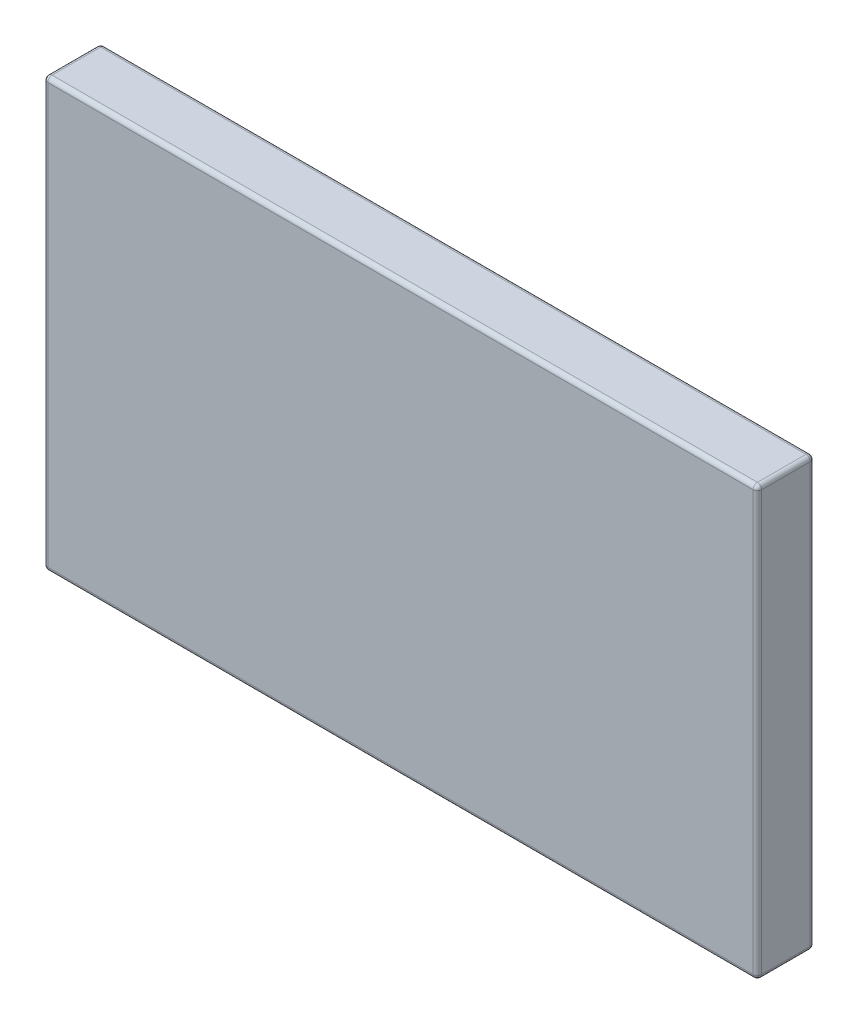
ISO-10303-21;
HEADER;
FILE_DESCRIPTION(('STEP AP214'),'2;1');
FILE_NAME('part.step','',(''),(''),'','','');
FILE_SCHEMA(('AUTOMOTIVE_DESIGN { 1 0 10303 214 1 1 1 1 }'));
ENDSEC;
DATA;
#1=APPLICATION_CONTEXT('core data for automotive mechanical design processes');
#2=APPLICATION_PROTOCOL_DEFINITION('international standard','automotive_design',2000,#1);
#3=PRODUCT_CONTEXT('',#1,'mechanical');
#4=PRODUCT('Part','Part','',(#3));
#5=PRODUCT_RELATED_PRODUCT_CATEGORY('part','',(#4));
#6=PRODUCT_DEFINITION_FORMATION('','',#4);
#7=PRODUCT_DEFINITION_CONTEXT('part definition',#1,'design');
#8=PRODUCT_DEFINITION('design','',#6,#7);
#9=PRODUCT_DEFINITION_SHAPE('','',#8);
#10=(LENGTH_UNIT() NAMED_UNIT(*) SI_UNIT(.MILLI.,.METRE.));
#11=(NAMED_UNIT(*) PLANE_ANGLE_UNIT() SI_UNIT($,.RADIAN.));
#12=(NAMED_UNIT(*) SI_UNIT($,.STERADIAN.) SOLID_ANGLE_UNIT());
#13=UNCERTAINTY_MEASURE_WITH_UNIT(LENGTH_MEASURE(1.E-05),#10,'distance_accuracy_value','');
#14=(GEOMETRIC_REPRESENTATION_CONTEXT(3) GLOBAL_UNCERTAINTY_ASSIGNED_CONTEXT((#13)) GLOBAL_UNIT_ASSIGNED_CONTEXT((#10,
#11,#12)) REPRESENTATION_CONTEXT('',''));
#15=CARTESIAN_POINT('',(0.,0.,0.));
#16=DIRECTION('',(0.,0.,1.));
#17=DIRECTION('',(1.,0.,0.));
#18=AXIS2_PLACEMENT_3D('',#15,#16,#17);
#19=CARTESIAN_POINT('',(25.,-15.,4.));
#20=DIRECTION('',(-1.,0.,0.));
#21=DIRECTION('',(0.,0.,1.));
#22=AXIS2_PLACEMENT_3D('',#19,#20,#21);
#23=PLANE('',#22);
#24=DIRECTION('',(0.,1.,0.));
#25=VECTOR('',#24,1.);
#26=CARTESIAN_POINT('',(25.,-15.,3.7));
#27=LINE('',#26,#25);
#28=CARTESIAN_POINT('',(25.,14.7,3.7));
#29=VERTEX_POINT('',#28);
#30=CARTESIAN_POINT('',(25.,-14.7,3.7));
#31=VERTEX_POINT('',#30);
#32=EDGE_CURVE('E108',#29,#31,#27,.F.);
#33=ORIENTED_EDGE('',*,*,#32,.T.);
#34=DIRECTION('',(0.,0.,-1.));
#35=VECTOR('',#34,1.);
#36=CARTESIAN_POINT('',(25.,-14.7,4.));
#37=LINE('',#36,#35);
#38=CARTESIAN_POINT('',(25.,-14.7,0.3));
#39=VERTEX_POINT('',#38);
#40=EDGE_CURVE('E148',#31,#39,#37,.T.);
#41=ORIENTED_EDGE('',*,*,#40,.T.);
#42=DIRECTION('',(0.,1.,0.));
#43=VECTOR('',#42,1.);
#44=CARTESIAN_POINT('',(25.,15.,0.3));
#45=LINE('',#44,#43);
#46=CARTESIAN_POINT('',(25.,14.7,0.3));
#47=VERTEX_POINT('',#46);
#48=EDGE_CURVE('E115',#39,#47,#45,.T.);
#49=ORIENTED_EDGE('',*,*,#48,.T.);
#50=DIRECTION('',(0.,0.,-1.));
#51=VECTOR('',#50,1.);
#52=CARTESIAN_POINT('',(25.,14.7,4.));
#53=LINE('',#52,#51);
#54=EDGE_CURVE('E104',#47,#29,#53,.F.);
#55=ORIENTED_EDGE('',*,*,#54,.T.);
#56=EDGE_LOOP('',(#33,#41,#49,#55));
#57=FACE_BOUND('',#56,.T.);
#58=ADVANCED_FACE('F17',(#57),#23,.F.);
#59=CARTESIAN_POINT('',(-25.,15.,4.));
#60=DIRECTION('',(0.,-1.,0.));
#61=DIRECTION('',(0.,0.,-1.));
#62=AXIS2_PLACEMENT_3D('',#59,#60,#61);
#63=PLANE('',#62);
#64=DIRECTION('',(0.,0.,-1.));
#65=VECTOR('',#64,1.);
#66=CARTESIAN_POINT('',(24.7,15.,4.));
#67=LINE('',#66,#65);
#68=CARTESIAN_POINT('',(24.7,15.,3.7));
#69=VERTEX_POINT('',#68);
#70=CARTESIAN_POINT('',(24.7,15.,0.3));
#71=VERTEX_POINT('',#70);
#72=EDGE_CURVE('E124',#69,#71,#67,.T.);
#73=ORIENTED_EDGE('',*,*,#72,.T.);
#74=DIRECTION('',(-1.,0.,0.));
#75=VECTOR('',#74,1.);
#76=CARTESIAN_POINT('',(-25.,15.,0.3));
#77=LINE('',#76,#75);
#78=CARTESIAN_POINT('',(-24.7,15.,0.3));
#79=VERTEX_POINT('',#78);
#80=EDGE_CURVE('E178',#71,#79,#77,.T.);
#81=ORIENTED_EDGE('',*,*,#80,.T.);
#82=DIRECTION('',(0.,0.,-1.));
#83=VECTOR('',#82,1.);
#84=CARTESIAN_POINT('',(-24.7,15.,4.));
#85=LINE('',#84,#83);
#86=CARTESIAN_POINT('',(-24.7,15.,3.7));
#87=VERTEX_POINT('',#86);
#88=EDGE_CURVE('E180',#79,#87,#85,.F.);
#89=ORIENTED_EDGE('',*,*,#88,.T.);
#90=DIRECTION('',(-1.,0.,0.));
#91=VECTOR('',#90,1.);
#92=CARTESIAN_POINT('',(-25.,15.,3.7));
#93=LINE('',#92,#91);
#94=EDGE_CURVE('E175',#87,#69,#93,.F.);
#95=ORIENTED_EDGE('',*,*,#94,.T.);
#96=EDGE_LOOP('',(#73,#81,#89,#95));
#97=FACE_BOUND('',#96,.T.);
#98=ADVANCED_FACE('F279',(#97),#63,.F.);
#99=CARTESIAN_POINT('',(-25.,-15.,4.));
#100=DIRECTION('',(1.,0.,0.));
#101=DIRECTION('',(0.,0.,-1.));
#102=AXIS2_PLACEMENT_3D('',#99,#100,#101);
#103=PLANE('',#102);
#104=DIRECTION('',(0.,-1.,0.));
#105=VECTOR('',#104,1.);
#106=CARTESIAN_POINT('',(-25.,-15.,0.3));
#107=LINE('',#106,#105);
#108=CARTESIAN_POINT('',(-25.,14.7,0.3));
#109=VERTEX_POINT('',#108);
#110=CARTESIAN_POINT('',(-25.,-14.7,0.3));
#111=VERTEX_POINT('',#110);
#112=EDGE_CURVE('E168',#109,#111,#107,.T.);
#113=ORIENTED_EDGE('',*,*,#112,.T.);
#114=DIRECTION('',(0.,0.,-1.));
#115=VECTOR('',#114,1.);
#116=CARTESIAN_POINT('',(-25.,-14.7,4.));
#117=LINE('',#116,#115);
#118=CARTESIAN_POINT('',(-25.,-14.7,3.7));
#119=VERTEX_POINT('',#118);
#120=EDGE_CURVE('E172',#111,#119,#117,.F.);
#121=ORIENTED_EDGE('',*,*,#120,.T.);
#122=DIRECTION('',(0.,-1.,0.));
#123=VECTOR('',#122,1.);
#124=CARTESIAN_POINT('',(-25.,-15.,3.7));
#125=LINE('',#124,#123);
#126=CARTESIAN_POINT('',(-25.,14.7,3.7));
#127=VERTEX_POINT('',#126);
#128=EDGE_CURVE('E167',#119,#127,#125,.F.);
#129=ORIENTED_EDGE('',*,*,#128,.T.);
#130=DIRECTION('',(0.,0.,-1.));
#131=VECTOR('',#130,1.);
#132=CARTESIAN_POINT('',(-25.,14.7,4.));
#133=LINE('',#132,#131);
#134=EDGE_CURVE('E169',#127,#109,#133,.T.);
#135=ORIENTED_EDGE('',*,*,#134,.T.);
#136=EDGE_LOOP('',(#113,#121,#129,#135));
#137=FACE_BOUND('',#136,.T.);
#138=ADVANCED_FACE('F260',(#137),#103,.F.);
#139=CARTESIAN_POINT('',(-25.,-15.,4.));
#140=DIRECTION('',(0.,1.,0.));
#141=DIRECTION('',(0.,0.,1.));
#142=AXIS2_PLACEMENT_3D('',#139,#140,#141);
#143=PLANE('',#142);
#144=DIRECTION('',(1.,0.,0.));
#145=VECTOR('',#144,1.);
#146=CARTESIAN_POINT('',(25.,-15.,0.3));
#147=LINE('',#146,#145);
#148=CARTESIAN_POINT('',(-24.7,-15.,0.3));
#149=VERTEX_POINT('',#148);
#150=CARTESIAN_POINT('',(24.7,-15.,0.3));
#151=VERTEX_POINT('',#150);
#152=EDGE_CURVE('E155',#149,#151,#147,.T.);
#153=ORIENTED_EDGE('',*,*,#152,.T.);
#154=DIRECTION('',(0.,0.,-1.));
#155=VECTOR('',#154,1.);
#156=CARTESIAN_POINT('',(24.7,-15.,4.));
#157=LINE('',#156,#155);
#158=CARTESIAN_POINT('',(24.7,-15.,3.7));
#159=VERTEX_POINT('',#158);
#160=EDGE_CURVE('E152',#151,#159,#157,.F.);
#161=ORIENTED_EDGE('',*,*,#160,.T.);
#162=DIRECTION('',(1.,0.,0.));
#163=VECTOR('',#162,1.);
#164=CARTESIAN_POINT('',(-25.,-15.,3.7));
#165=LINE('',#164,#163);
#166=CARTESIAN_POINT('',(-24.7,-15.,3.7));
#167=VERTEX_POINT('',#166);
#168=EDGE_CURVE('E146',#159,#167,#165,.F.);
#169=ORIENTED_EDGE('',*,*,#168,.T.);
#170=DIRECTION('',(0.,0.,-1.));
#171=VECTOR('',#170,1.);
#172=CARTESIAN_POINT('',(-24.7,-15.,4.));
#173=LINE('',#172,#171);
#174=EDGE_CURVE('E147',#167,#149,#173,.T.);
#175=ORIENTED_EDGE('',*,*,#174,.T.);
#176=EDGE_LOOP('',(#153,#161,#169,#175));
#177=FACE_BOUND('',#176,.T.);
#178=ADVANCED_FACE('F290',(#177),#143,.F.);
#179=CARTESIAN_POINT('',(0.,0.,4.));
#180=DIRECTION('',(0.,0.,-1.));
#181=DIRECTION('',(-1.,0.,0.));
#182=AXIS2_PLACEMENT_3D('',#179,#180,#181);
#183=PLANE('',#182);
#184=DIRECTION('',(0.,-1.,0.));
#185=VECTOR('',#184,1.);
#186=CARTESIAN_POINT('',(-24.7,0.,4.));
#187=LINE('',#186,#185);
#188=CARTESIAN_POINT('',(-24.7,14.7,4.));
#189=VERTEX_POINT('',#188);
#190=CARTESIAN_POINT('',(-24.7,-14.7,4.));
#191=VERTEX_POINT('',#190);
#192=EDGE_CURVE('E27',#189,#191,#187,.T.);
#193=ORIENTED_EDGE('',*,*,#192,.T.);
#194=DIRECTION('',(1.,0.,0.));
#195=VECTOR('',#194,1.);
#196=CARTESIAN_POINT('',(0.,-14.7,4.));
#197=LINE('',#196,#195);
#198=CARTESIAN_POINT('',(24.7,-14.7,4.));
#199=VERTEX_POINT('',#198);
#200=EDGE_CURVE('E11',#191,#199,#197,.T.);
#201=ORIENTED_EDGE('',*,*,#200,.T.);
#202=DIRECTION('',(0.,1.,0.));
#203=VECTOR('',#202,1.);
#204=CARTESIAN_POINT('',(24.7,0.,4.));
#205=LINE('',#204,#203);
#206=CARTESIAN_POINT('',(24.7,14.7,4.));
#207=VERTEX_POINT('',#206);
#208=EDGE_CURVE('E181',#199,#207,#205,.T.);
#209=ORIENTED_EDGE('',*,*,#208,.T.);
#210=DIRECTION('',(-1.,0.,0.));
#211=VECTOR('',#210,1.);
#212=CARTESIAN_POINT('',(0.,14.7,4.));
#213=LINE('',#212,#211);
#214=EDGE_CURVE('E40',#207,#189,#213,.T.);
#215=ORIENTED_EDGE('',*,*,#214,.T.);
#216=EDGE_LOOP('',(#193,#201,#209,#215));
#217=FACE_BOUND('',#216,.T.);
#218=ADVANCED_FACE('F352',(#217),#183,.F.);
#219=CARTESIAN_POINT('',(0.,0.,0.));
#220=DIRECTION('',(0.,0.,-1.));
#221=DIRECTION('',(-1.,0.,0.));
#222=AXIS2_PLACEMENT_3D('',#219,#220,#221);
#223=PLANE('',#222);
#224=DIRECTION('',(0.,1.,0.));
#225=VECTOR('',#224,1.);
#226=CARTESIAN_POINT('',(24.7,-15.,0.));
#227=LINE('',#226,#225);
#228=CARTESIAN_POINT('',(24.7,14.7,0.));
#229=VERTEX_POINT('',#228);
#230=CARTESIAN_POINT('',(24.7,-14.7,0.));
#231=VERTEX_POINT('',#230);
#232=EDGE_CURVE('E161',#229,#231,#227,.F.);
#233=ORIENTED_EDGE('',*,*,#232,.T.);
#234=DIRECTION('',(1.,0.,0.));
#235=VECTOR('',#234,1.);
#236=CARTESIAN_POINT('',(-25.,-14.7,0.));
#237=LINE('',#236,#235);
#238=CARTESIAN_POINT('',(-24.7,-14.7,0.));
#239=VERTEX_POINT('',#238);
#240=EDGE_CURVE('E162',#231,#239,#237,.F.);
#241=ORIENTED_EDGE('',*,*,#240,.T.);
#242=DIRECTION('',(0.,-1.,0.));
#243=VECTOR('',#242,1.);
#244=CARTESIAN_POINT('',(-24.7,15.,0.));
#245=LINE('',#244,#243);
#246=CARTESIAN_POINT('',(-24.7,14.7,0.));
#247=VERTEX_POINT('',#246);
#248=EDGE_CURVE('E157',#239,#247,#245,.F.);
#249=ORIENTED_EDGE('',*,*,#248,.T.);
#250=DIRECTION('',(-1.,0.,0.));
#251=VECTOR('',#250,1.);
#252=CARTESIAN_POINT('',(25.,14.7,0.));
#253=LINE('',#252,#251);
#254=EDGE_CURVE('E160',#247,#229,#253,.F.);
#255=ORIENTED_EDGE('',*,*,#254,.T.);
#256=EDGE_LOOP('',(#233,#241,#249,#255));
#257=FACE_BOUND('',#256,.T.);
#258=ADVANCED_FACE('F249',(#257),#223,.T.);
#259=CARTESIAN_POINT('',(-24.7,14.7,4.));
#260=DIRECTION('',(0.,0.,-1.));
#261=DIRECTION('',(-1.,0.,0.));
#262=AXIS2_PLACEMENT_3D('',#259,#260,#261);
#263=CYLINDRICAL_SURFACE('',#262,0.3);
#264=CARTESIAN_POINT('',(-24.7,14.7,3.7));
#265=DIRECTION('',(0.,0.,1.));
#266=DIRECTION('',(1.,0.,0.));
#267=AXIS2_PLACEMENT_3D('',#264,#265,#266);
#268=CIRCLE('',#267,0.3);
#269=EDGE_CURVE('E21',#87,#127,#268,.T.);
#270=ORIENTED_EDGE('',*,*,#269,.F.);
#271=ORIENTED_EDGE('',*,*,#88,.F.);
#272=CARTESIAN_POINT('',(-24.7,14.7,0.3));
#273=DIRECTION('',(0.,0.,-1.));
#274=DIRECTION('',(-1.,0.,0.));
#275=AXIS2_PLACEMENT_3D('',#272,#273,#274);
#276=CIRCLE('',#275,0.3);
#277=EDGE_CURVE('E141',#109,#79,#276,.T.);
#278=ORIENTED_EDGE('',*,*,#277,.F.);
#279=ORIENTED_EDGE('',*,*,#134,.F.);
#280=EDGE_LOOP('',(#270,#271,#278,#279));
#281=FACE_BOUND('',#280,.T.);
#282=ADVANCED_FACE('F19',(#281),#263,.T.);
#283=CARTESIAN_POINT('',(-24.7,14.7,3.7));
#284=DIRECTION('',(0.,0.,1.));
#285=DIRECTION('',(1.,0.,0.));
#286=AXIS2_PLACEMENT_3D('',#283,#284,#285);
#287=SPHERICAL_SURFACE('',#286,0.3);
#288=CARTESIAN_POINT('',(-24.7,14.7,3.7));
#289=DIRECTION('',(-1.,0.,0.));
#290=DIRECTION('',(0.,0.,1.));
#291=AXIS2_PLACEMENT_3D('',#288,#289,#290);
#292=CIRCLE('',#291,0.3);
#293=EDGE_CURVE('E227',#87,#189,#292,.F.);
#294=ORIENTED_EDGE('',*,*,#293,.F.);
#295=ORIENTED_EDGE('',*,*,#269,.T.);
#296=CARTESIAN_POINT('',(-24.7,14.7,3.7));
#297=DIRECTION('',(0.,1.,0.));
#298=DIRECTION('',(0.,0.,1.));
#299=AXIS2_PLACEMENT_3D('',#296,#297,#298);
#300=CIRCLE('',#299,0.3);
#301=EDGE_CURVE('E228',#189,#127,#300,.F.);
#302=ORIENTED_EDGE('',*,*,#301,.F.);
#303=EDGE_LOOP('',(#294,#295,#302));
#304=FACE_BOUND('',#303,.T.);
#305=ADVANCED_FACE('F272',(#304),#287,.T.);
#306=CARTESIAN_POINT('',(-24.7,14.7,0.3));
#307=DIRECTION('',(0.,0.,1.));
#308=DIRECTION('',(1.,0.,0.));
#309=AXIS2_PLACEMENT_3D('',#306,#307,#308);
#310=SPHERICAL_SURFACE('',#309,0.3);
#311=CARTESIAN_POINT('',(-24.7,14.7,0.3));
#312=DIRECTION('',(0.,1.,0.));
#313=DIRECTION('',(-1.,0.,0.));
#314=AXIS2_PLACEMENT_3D('',#311,#312,#313);
#315=CIRCLE('',#314,0.3);
#316=EDGE_CURVE('E222',#109,#247,#315,.F.);
#317=ORIENTED_EDGE('',*,*,#316,.F.);
#318=ORIENTED_EDGE('',*,*,#277,.T.);
#319=CARTESIAN_POINT('',(-24.7,14.7,0.3));
#320=DIRECTION('',(-1.,0.,0.));
#321=DIRECTION('',(0.,0.,1.));
#322=AXIS2_PLACEMENT_3D('',#319,#320,#321);
#323=CIRCLE('',#322,0.3);
#324=EDGE_CURVE('E221',#247,#79,#323,.F.);
#325=ORIENTED_EDGE('',*,*,#324,.F.);
#326=EDGE_LOOP('',(#317,#318,#325));
#327=FACE_BOUND('',#326,.T.);
#328=ADVANCED_FACE('F240',(#327),#310,.T.);
#329=CARTESIAN_POINT('',(-24.7,0.,3.7));
#330=DIRECTION('',(0.,-1.,0.));
#331=DIRECTION('',(0.,0.,-1.));
#332=AXIS2_PLACEMENT_3D('',#329,#330,#331);
#333=CYLINDRICAL_SURFACE('',#332,0.3);
#334=ORIENTED_EDGE('',*,*,#301,.T.);
#335=ORIENTED_EDGE('',*,*,#128,.F.);
#336=CARTESIAN_POINT('',(-24.7,-14.7,3.7));
#337=DIRECTION('',(0.,-1.,0.));
#338=DIRECTION('',(0.,0.,-1.));
#339=AXIS2_PLACEMENT_3D('',#336,#337,#338);
#340=CIRCLE('',#339,0.3);
#341=EDGE_CURVE('E216',#191,#119,#340,.T.);
#342=ORIENTED_EDGE('',*,*,#341,.F.);
#343=ORIENTED_EDGE('',*,*,#192,.F.);
#344=EDGE_LOOP('',(#334,#335,#342,#343));
#345=FACE_BOUND('',#344,.T.);
#346=ADVANCED_FACE('F268',(#345),#333,.T.);
#347=CARTESIAN_POINT('',(0.,14.7,3.7));
#348=DIRECTION('',(-1.,0.,0.));
#349=DIRECTION('',(0.,0.,1.));
#350=AXIS2_PLACEMENT_3D('',#347,#348,#349);
#351=CYLINDRICAL_SURFACE('',#350,0.3);
#352=ORIENTED_EDGE('',*,*,#293,.T.);
#353=ORIENTED_EDGE('',*,*,#214,.F.);
#354=CARTESIAN_POINT('',(24.7,14.7,3.7));
#355=DIRECTION('',(1.,0.,0.));
#356=DIRECTION('',(0.,0.,-1.));
#357=AXIS2_PLACEMENT_3D('',#354,#355,#356);
#358=CIRCLE('',#357,0.3);
#359=EDGE_CURVE('E126',#69,#207,#358,.T.);
#360=ORIENTED_EDGE('',*,*,#359,.F.);
#361=ORIENTED_EDGE('',*,*,#94,.F.);
#362=EDGE_LOOP('',(#352,#353,#360,#361));
#363=FACE_BOUND('',#362,.T.);
#364=ADVANCED_FACE('F277',(#363),#351,.T.);
#365=CARTESIAN_POINT('',(24.7,14.7,4.));
#366=DIRECTION('',(0.,0.,-1.));
#367=DIRECTION('',(-1.,0.,0.));
#368=AXIS2_PLACEMENT_3D('',#365,#366,#367);
#369=CYLINDRICAL_SURFACE('',#368,0.3);
#370=CARTESIAN_POINT('',(24.7,14.7,0.3));
#371=DIRECTION('',(0.,0.,-1.));
#372=DIRECTION('',(-1.,0.,0.));
#373=AXIS2_PLACEMENT_3D('',#370,#371,#372);
#374=CIRCLE('',#373,0.3);
#375=EDGE_CURVE('E128',#71,#47,#374,.T.);
#376=ORIENTED_EDGE('',*,*,#375,.F.);
#377=ORIENTED_EDGE('',*,*,#72,.F.);
#378=CARTESIAN_POINT('',(24.7,14.7,3.7));
#379=DIRECTION('',(0.,0.,1.));
#380=DIRECTION('',(1.,0.,0.));
#381=AXIS2_PLACEMENT_3D('',#378,#379,#380);
#382=CIRCLE('',#381,0.3);
#383=EDGE_CURVE('E118',#29,#69,#382,.T.);
#384=ORIENTED_EDGE('',*,*,#383,.F.);
#385=ORIENTED_EDGE('',*,*,#54,.F.);
#386=EDGE_LOOP('',(#376,#377,#384,#385));
#387=FACE_BOUND('',#386,.T.);
#388=ADVANCED_FACE('F122',(#387),#369,.T.);
#389=CARTESIAN_POINT('',(-25.,14.7,0.3));
#390=DIRECTION('',(1.,0.,0.));
#391=DIRECTION('',(0.,0.,-1.));
#392=AXIS2_PLACEMENT_3D('',#389,#390,#391);
#393=CYLINDRICAL_SURFACE('',#392,0.3);
#394=ORIENTED_EDGE('',*,*,#324,.T.);
#395=ORIENTED_EDGE('',*,*,#80,.F.);
#396=CARTESIAN_POINT('',(24.7,14.7,0.3));
#397=DIRECTION('',(1.,0.,0.));
#398=DIRECTION('',(0.,0.,-1.));
#399=AXIS2_PLACEMENT_3D('',#396,#397,#398);
#400=CIRCLE('',#399,0.3);
#401=EDGE_CURVE('E215',#229,#71,#400,.T.);
#402=ORIENTED_EDGE('',*,*,#401,.F.);
#403=ORIENTED_EDGE('',*,*,#254,.F.);
#404=EDGE_LOOP('',(#394,#395,#402,#403));
#405=FACE_BOUND('',#404,.T.);
#406=ADVANCED_FACE('F243',(#405),#393,.T.);
#407=CARTESIAN_POINT('',(-24.7,-15.,0.3));
#408=DIRECTION('',(0.,1.,0.));
#409=DIRECTION('',(0.,0.,1.));
#410=AXIS2_PLACEMENT_3D('',#407,#408,#409);
#411=CYLINDRICAL_SURFACE('',#410,0.3);
#412=ORIENTED_EDGE('',*,*,#316,.T.);
#413=ORIENTED_EDGE('',*,*,#248,.F.);
#414=CARTESIAN_POINT('',(-24.7,-14.7,0.3));
#415=DIRECTION('',(0.,-1.,0.));
#416=DIRECTION('',(0.,0.,-1.));
#417=AXIS2_PLACEMENT_3D('',#414,#415,#416);
#418=CIRCLE('',#417,0.3);
#419=EDGE_CURVE('E207',#111,#239,#418,.T.);
#420=ORIENTED_EDGE('',*,*,#419,.F.);
#421=ORIENTED_EDGE('',*,*,#112,.F.);
#422=EDGE_LOOP('',(#412,#413,#420,#421));
#423=FACE_BOUND('',#422,.T.);
#424=ADVANCED_FACE('F255',(#423),#411,.T.);
#425=CARTESIAN_POINT('',(-24.7,-14.7,4.));
#426=DIRECTION('',(0.,0.,-1.));
#427=DIRECTION('',(-1.,0.,0.));
#428=AXIS2_PLACEMENT_3D('',#425,#426,#427);
#429=CYLINDRICAL_SURFACE('',#428,0.3);
#430=CARTESIAN_POINT('',(-24.7,-14.7,3.7));
#431=DIRECTION('',(0.,0.,1.));
#432=DIRECTION('',(1.,0.,0.));
#433=AXIS2_PLACEMENT_3D('',#430,#431,#432);
#434=CIRCLE('',#433,0.3);
#435=EDGE_CURVE('E217',#119,#167,#434,.T.);
#436=ORIENTED_EDGE('',*,*,#435,.F.);
#437=ORIENTED_EDGE('',*,*,#120,.F.);
#438=CARTESIAN_POINT('',(-24.7,-14.7,0.3));
#439=DIRECTION('',(0.,0.,-1.));
#440=DIRECTION('',(-1.,0.,0.));
#441=AXIS2_PLACEMENT_3D('',#438,#439,#440);
#442=CIRCLE('',#441,0.3);
#443=EDGE_CURVE('E206',#149,#111,#442,.T.);
#444=ORIENTED_EDGE('',*,*,#443,.F.);
#445=ORIENTED_EDGE('',*,*,#174,.F.);
#446=EDGE_LOOP('',(#436,#437,#444,#445));
#447=FACE_BOUND('',#446,.T.);
#448=ADVANCED_FACE('F261',(#447),#429,.T.);
#449=CARTESIAN_POINT('',(-24.7,-14.7,3.7));
#450=DIRECTION('',(0.,0.,1.));
#451=DIRECTION('',(1.,0.,0.));
#452=AXIS2_PLACEMENT_3D('',#449,#450,#451);
#453=SPHERICAL_SURFACE('',#452,0.3);
#454=ORIENTED_EDGE('',*,*,#341,.T.);
#455=ORIENTED_EDGE('',*,*,#435,.T.);
#456=CARTESIAN_POINT('',(-24.7,-14.7,3.7));
#457=DIRECTION('',(-1.,0.,0.));
#458=DIRECTION('',(0.,0.,1.));
#459=AXIS2_PLACEMENT_3D('',#456,#457,#458);
#460=CIRCLE('',#459,0.3);
#461=EDGE_CURVE('E134',#191,#167,#460,.F.);
#462=ORIENTED_EDGE('',*,*,#461,.F.);
#463=EDGE_LOOP('',(#454,#455,#462));
#464=FACE_BOUND('',#463,.T.);
#465=ADVANCED_FACE('F327',(#464),#453,.T.);
#466=CARTESIAN_POINT('',(24.7,14.7,3.7));
#467=DIRECTION('',(0.,0.,1.));
#468=DIRECTION('',(1.,0.,0.));
#469=AXIS2_PLACEMENT_3D('',#466,#467,#468);
#470=SPHERICAL_SURFACE('',#469,0.3);
#471=ORIENTED_EDGE('',*,*,#383,.T.);
#472=ORIENTED_EDGE('',*,*,#359,.T.);
#473=CARTESIAN_POINT('',(24.7,14.7,3.7));
#474=DIRECTION('',(0.,1.,0.));
#475=DIRECTION('',(0.,0.,1.));
#476=AXIS2_PLACEMENT_3D('',#473,#474,#475);
#477=CIRCLE('',#476,0.3);
#478=EDGE_CURVE('E131',#29,#207,#477,.F.);
#479=ORIENTED_EDGE('',*,*,#478,.F.);
#480=EDGE_LOOP('',(#471,#472,#479));
#481=FACE_BOUND('',#480,.T.);
#482=ADVANCED_FACE('F135',(#481),#470,.T.);
#483=CARTESIAN_POINT('',(24.7,14.7,0.3));
#484=DIRECTION('',(0.,0.,1.));
#485=DIRECTION('',(1.,0.,0.));
#486=AXIS2_PLACEMENT_3D('',#483,#484,#485);
#487=SPHERICAL_SURFACE('',#486,0.3);
#488=ORIENTED_EDGE('',*,*,#401,.T.);
#489=ORIENTED_EDGE('',*,*,#375,.T.);
#490=CARTESIAN_POINT('',(24.7,14.7,0.3));
#491=DIRECTION('',(0.,1.,0.));
#492=DIRECTION('',(0.,0.,1.));
#493=AXIS2_PLACEMENT_3D('',#490,#491,#492);
#494=CIRCLE('',#493,0.3);
#495=EDGE_CURVE('E137',#229,#47,#494,.F.);
#496=ORIENTED_EDGE('',*,*,#495,.F.);
#497=EDGE_LOOP('',(#488,#489,#496));
#498=FACE_BOUND('',#497,.T.);
#499=ADVANCED_FACE('F321',(#498),#487,.T.);
#500=CARTESIAN_POINT('',(-24.7,-14.7,0.3));
#501=DIRECTION('',(0.,0.,1.));
#502=DIRECTION('',(1.,0.,0.));
#503=AXIS2_PLACEMENT_3D('',#500,#501,#502);
#504=SPHERICAL_SURFACE('',#503,0.3);
#505=ORIENTED_EDGE('',*,*,#443,.T.);
#506=ORIENTED_EDGE('',*,*,#419,.T.);
#507=CARTESIAN_POINT('',(-24.7,-14.7,0.3));
#508=DIRECTION('',(-1.,0.,0.));
#509=DIRECTION('',(0.,0.,1.));
#510=AXIS2_PLACEMENT_3D('',#507,#508,#509);
#511=CIRCLE('',#510,0.3);
#512=EDGE_CURVE('E199',#149,#239,#511,.F.);
#513=ORIENTED_EDGE('',*,*,#512,.F.);
#514=EDGE_LOOP('',(#505,#506,#513));
#515=FACE_BOUND('',#514,.T.);
#516=ADVANCED_FACE('F320',(#515),#504,.T.);
#517=CARTESIAN_POINT('',(0.,-14.7,3.7));
#518=DIRECTION('',(1.,0.,0.));
#519=DIRECTION('',(0.,0.,-1.));
#520=AXIS2_PLACEMENT_3D('',#517,#518,#519);
#521=CYLINDRICAL_SURFACE('',#520,0.3);
#522=ORIENTED_EDGE('',*,*,#461,.T.);
#523=ORIENTED_EDGE('',*,*,#168,.F.);
#524=CARTESIAN_POINT('',(24.7,-14.7,3.7));
#525=DIRECTION('',(1.,0.,0.));
#526=DIRECTION('',(0.,0.,-1.));
#527=AXIS2_PLACEMENT_3D('',#524,#525,#526);
#528=CIRCLE('',#527,0.3);
#529=EDGE_CURVE('E197',#199,#159,#528,.T.);
#530=ORIENTED_EDGE('',*,*,#529,.F.);
#531=ORIENTED_EDGE('',*,*,#200,.F.);
#532=EDGE_LOOP('',(#522,#523,#530,#531));
#533=FACE_BOUND('',#532,.T.);
#534=ADVANCED_FACE('F314',(#533),#521,.T.);
#535=CARTESIAN_POINT('',(24.7,0.,3.7));
#536=DIRECTION('',(0.,1.,0.));
#537=DIRECTION('',(0.,0.,1.));
#538=AXIS2_PLACEMENT_3D('',#535,#536,#537);
#539=CYLINDRICAL_SURFACE('',#538,0.3);
#540=ORIENTED_EDGE('',*,*,#478,.T.);
#541=ORIENTED_EDGE('',*,*,#208,.F.);
#542=CARTESIAN_POINT('',(24.7,-14.7,3.7));
#543=DIRECTION('',(0.,-1.,0.));
#544=DIRECTION('',(0.,0.,-1.));
#545=AXIS2_PLACEMENT_3D('',#542,#543,#544);
#546=CIRCLE('',#545,0.3);
#547=EDGE_CURVE('E136',#31,#199,#546,.T.);
#548=ORIENTED_EDGE('',*,*,#547,.F.);
#549=ORIENTED_EDGE('',*,*,#32,.F.);
#550=EDGE_LOOP('',(#540,#541,#548,#549));
#551=FACE_BOUND('',#550,.T.);
#552=ADVANCED_FACE('F139',(#551),#539,.T.);
#553=CARTESIAN_POINT('',(24.7,-15.,0.3));
#554=DIRECTION('',(0.,-1.,0.));
#555=DIRECTION('',(0.,0.,-1.));
#556=AXIS2_PLACEMENT_3D('',#553,#554,#555);
#557=CYLINDRICAL_SURFACE('',#556,0.3);
#558=ORIENTED_EDGE('',*,*,#495,.T.);
#559=ORIENTED_EDGE('',*,*,#48,.F.);
#560=CARTESIAN_POINT('',(24.7,-14.7,0.3));
#561=DIRECTION('',(0.,-1.,0.));
#562=DIRECTION('',(0.,0.,-1.));
#563=AXIS2_PLACEMENT_3D('',#560,#561,#562);
#564=CIRCLE('',#563,0.3);
#565=EDGE_CURVE('E194',#231,#39,#564,.T.);
#566=ORIENTED_EDGE('',*,*,#565,.F.);
#567=ORIENTED_EDGE('',*,*,#232,.F.);
#568=EDGE_LOOP('',(#558,#559,#566,#567));
#569=FACE_BOUND('',#568,.T.);
#570=ADVANCED_FACE('F307',(#569),#557,.T.);
#571=CARTESIAN_POINT('',(-25.,-14.7,0.3));
#572=DIRECTION('',(-1.,0.,0.));
#573=DIRECTION('',(0.,0.,1.));
#574=AXIS2_PLACEMENT_3D('',#571,#572,#573);
#575=CYLINDRICAL_SURFACE('',#574,0.3);
#576=ORIENTED_EDGE('',*,*,#512,.T.);
#577=ORIENTED_EDGE('',*,*,#240,.F.);
#578=CARTESIAN_POINT('',(24.7,-14.7,0.3));
#579=DIRECTION('',(1.,0.,0.));
#580=DIRECTION('',(0.,0.,-1.));
#581=AXIS2_PLACEMENT_3D('',#578,#579,#580);
#582=CIRCLE('',#581,0.3);
#583=EDGE_CURVE('E189',#151,#231,#582,.T.);
#584=ORIENTED_EDGE('',*,*,#583,.F.);
#585=ORIENTED_EDGE('',*,*,#152,.F.);
#586=EDGE_LOOP('',(#576,#577,#584,#585));
#587=FACE_BOUND('',#586,.T.);
#588=ADVANCED_FACE('F304',(#587),#575,.T.);
#589=CARTESIAN_POINT('',(24.7,-14.7,3.7));
#590=DIRECTION('',(0.,0.,1.));
#591=DIRECTION('',(1.,0.,0.));
#592=AXIS2_PLACEMENT_3D('',#589,#590,#591);
#593=SPHERICAL_SURFACE('',#592,0.3);
#594=ORIENTED_EDGE('',*,*,#547,.T.);
#595=ORIENTED_EDGE('',*,*,#529,.T.);
#596=CARTESIAN_POINT('',(24.7,-14.7,3.7));
#597=DIRECTION('',(0.,0.,1.));
#598=DIRECTION('',(1.,0.,0.));
#599=AXIS2_PLACEMENT_3D('',#596,#597,#598);
#600=CIRCLE('',#599,0.3);
#601=EDGE_CURVE('E187',#31,#159,#600,.F.);
#602=ORIENTED_EDGE('',*,*,#601,.F.);
#603=EDGE_LOOP('',(#594,#595,#602));
#604=FACE_BOUND('',#603,.T.);
#605=ADVANCED_FACE('F298',(#604),#593,.T.);
#606=CARTESIAN_POINT('',(24.7,-14.7,0.3));
#607=DIRECTION('',(0.,0.,1.));
#608=DIRECTION('',(1.,0.,0.));
#609=AXIS2_PLACEMENT_3D('',#606,#607,#608);
#610=SPHERICAL_SURFACE('',#609,0.3);
#611=ORIENTED_EDGE('',*,*,#583,.T.);
#612=ORIENTED_EDGE('',*,*,#565,.T.);
#613=CARTESIAN_POINT('',(24.7,-14.7,0.3));
#614=DIRECTION('',(0.,0.,-1.));
#615=DIRECTION('',(-1.,0.,0.));
#616=AXIS2_PLACEMENT_3D('',#613,#614,#615);
#617=CIRCLE('',#616,0.3);
#618=EDGE_CURVE('E186',#151,#39,#617,.F.);
#619=ORIENTED_EDGE('',*,*,#618,.F.);
#620=EDGE_LOOP('',(#611,#612,#619));
#621=FACE_BOUND('',#620,.T.);
#622=ADVANCED_FACE('F294',(#621),#610,.T.);
#623=CARTESIAN_POINT('',(24.7,-14.7,4.));
#624=DIRECTION('',(0.,0.,-1.));
#625=DIRECTION('',(-1.,0.,0.));
#626=AXIS2_PLACEMENT_3D('',#623,#624,#625);
#627=CYLINDRICAL_SURFACE('',#626,0.3);
#628=ORIENTED_EDGE('',*,*,#601,.T.);
#629=ORIENTED_EDGE('',*,*,#160,.F.);
#630=ORIENTED_EDGE('',*,*,#618,.T.);
#631=ORIENTED_EDGE('',*,*,#40,.F.);
#632=EDGE_LOOP('',(#628,#629,#630,#631));
#633=FACE_BOUND('',#632,.T.);
#634=ADVANCED_FACE('F291',(#633),#627,.T.);
#635=CLOSED_SHELL('',(#58,#98,#138,#178,#218,#258,#282,#305,#328,#346,#364,#388,#406,#424,#448,
#465,#482,#499,#516,#534,#552,#570,#588,#605,#622,#634));
#636=MANIFOLD_SOLID_BREP('B1',#635);
#637=ADVANCED_BREP_SHAPE_REPRESENTATION('',(#18,#636),#14);
#638=SHAPE_DEFINITION_REPRESENTATION(#9,#637);
ENDSEC;
END-ISO-10303-21;
